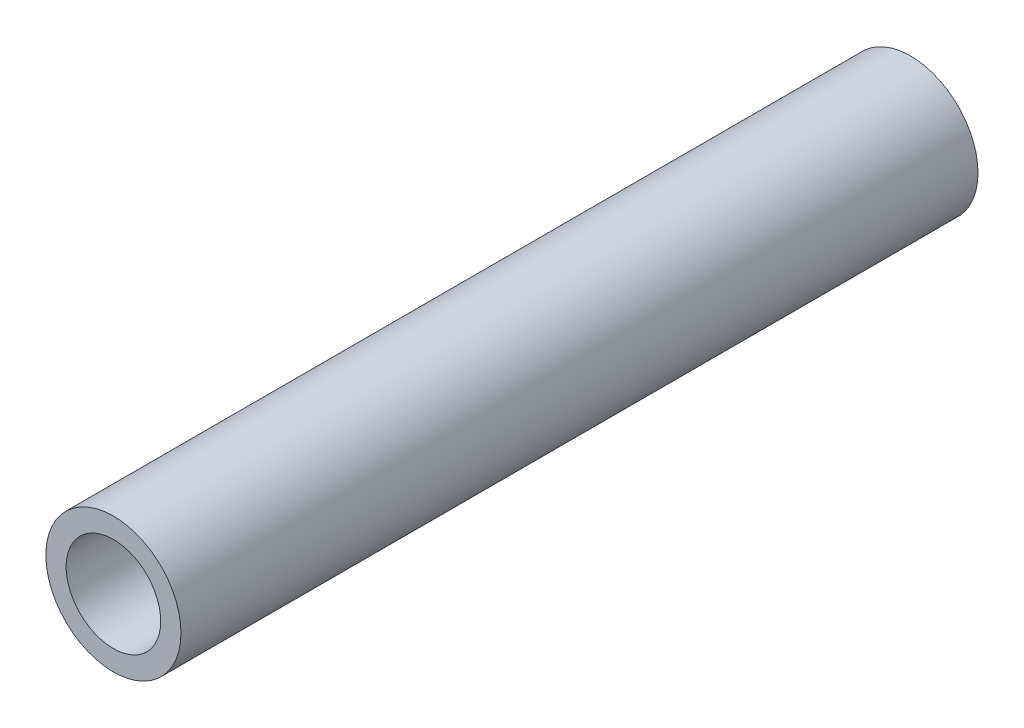
ISO-10303-21;
HEADER;
FILE_DESCRIPTION(('STEP AP214'),'2;1');
FILE_NAME('part.step','',(''),(''),'','','');
FILE_SCHEMA(('AUTOMOTIVE_DESIGN { 1 0 10303 214 1 1 1 1 }'));
ENDSEC;
DATA;
#1=APPLICATION_CONTEXT('core data for automotive mechanical design processes');
#2=APPLICATION_PROTOCOL_DEFINITION('international standard','automotive_design',2000,#1);
#3=PRODUCT_CONTEXT('',#1,'mechanical');
#4=PRODUCT('Part','Part','',(#3));
#5=PRODUCT_RELATED_PRODUCT_CATEGORY('part','',(#4));
#6=PRODUCT_DEFINITION_FORMATION('','',#4);
#7=PRODUCT_DEFINITION_CONTEXT('part definition',#1,'design');
#8=PRODUCT_DEFINITION('design','',#6,#7);
#9=PRODUCT_DEFINITION_SHAPE('','',#8);
#10=(LENGTH_UNIT() NAMED_UNIT(*) SI_UNIT(.MILLI.,.METRE.));
#11=(NAMED_UNIT(*) PLANE_ANGLE_UNIT() SI_UNIT($,.RADIAN.));
#12=(NAMED_UNIT(*) SI_UNIT($,.STERADIAN.) SOLID_ANGLE_UNIT());
#13=UNCERTAINTY_MEASURE_WITH_UNIT(LENGTH_MEASURE(1.E-05),#10,'distance_accuracy_value','');
#14=(GEOMETRIC_REPRESENTATION_CONTEXT(3) GLOBAL_UNCERTAINTY_ASSIGNED_CONTEXT((#13)) GLOBAL_UNIT_ASSIGNED_CONTEXT((#10,
#11,#12)) REPRESENTATION_CONTEXT('',''));
#15=CARTESIAN_POINT('',(0.,0.,0.));
#16=DIRECTION('',(0.,0.,1.));
#17=DIRECTION('',(1.,0.,0.));
#18=AXIS2_PLACEMENT_3D('',#15,#16,#17);
#19=CARTESIAN_POINT('',(0.,0.,10.9));
#20=DIRECTION('',(0.,0.,-1.));
#21=DIRECTION('',(0.,-1.,0.));
#22=AXIS2_PLACEMENT_3D('',#19,#20,#21);
#23=PLANE('',#22);
#24=CARTESIAN_POINT('',(0.,0.,10.9));
#25=DIRECTION('',(0.,0.,-1.));
#26=DIRECTION('',(1.,0.,0.));
#27=AXIS2_PLACEMENT_3D('',#24,#25,#26);
#28=CIRCLE('',#27,1.05);
#29=CARTESIAN_POINT('',(1.05,0.,10.9));
#30=VERTEX_POINT('',#29);
#31=EDGE_CURVE('E22',#30,#30,#28,.T.);
#32=ORIENTED_EDGE('',*,*,#31,.T.);
#33=EDGE_LOOP('',(#32));
#34=FACE_BOUND('',#33,.T.);
#35=CARTESIAN_POINT('',(0.,0.,10.9));
#36=DIRECTION('',(0.,0.,1.));
#37=DIRECTION('',(1.,0.,0.));
#38=AXIS2_PLACEMENT_3D('',#35,#36,#37);
#39=CIRCLE('',#38,1.5);
#40=CARTESIAN_POINT('',(1.5,0.,10.9));
#41=VERTEX_POINT('',#40);
#42=EDGE_CURVE('E10',#41,#41,#39,.T.);
#43=ORIENTED_EDGE('',*,*,#42,.T.);
#44=EDGE_LOOP('',(#43));
#45=FACE_BOUND('',#44,.T.);
#46=ADVANCED_FACE('F15',(#34,#45),#23,.F.);
#47=CARTESIAN_POINT('',(0.,0.,8.9));
#48=DIRECTION('',(0.,0.,1.));
#49=DIRECTION('',(1.,0.,0.));
#50=AXIS2_PLACEMENT_3D('',#47,#48,#49);
#51=CYLINDRICAL_SURFACE('',#50,1.5);
#52=CARTESIAN_POINT('',(0.,0.,-6.8000000000001));
#53=DIRECTION('',(0.,0.,-1.));
#54=DIRECTION('',(1.,0.,0.));
#55=AXIS2_PLACEMENT_3D('',#52,#53,#54);
#56=CIRCLE('',#55,1.5);
#57=CARTESIAN_POINT('',(1.5,0.,-6.8000000000001));
#58=VERTEX_POINT('',#57);
#59=EDGE_CURVE('E44',#58,#58,#56,.T.);
#60=ORIENTED_EDGE('',*,*,#59,.F.);
#61=EDGE_LOOP('',(#60));
#62=FACE_BOUND('',#61,.T.);
#63=ORIENTED_EDGE('',*,*,#42,.F.);
#64=EDGE_LOOP('',(#63));
#65=FACE_BOUND('',#64,.T.);
#66=ADVANCED_FACE('F70',(#62,#65),#51,.T.);
#67=CARTESIAN_POINT('',(0.,0.,8.9));
#68=DIRECTION('',(0.,0.,1.));
#69=DIRECTION('',(1.,0.,0.));
#70=AXIS2_PLACEMENT_3D('',#67,#68,#69);
#71=CYLINDRICAL_SURFACE('',#70,1.05);
#72=CARTESIAN_POINT('',(0.,0.,8.9));
#73=DIRECTION('',(0.,0.,-1.));
#74=DIRECTION('',(1.,0.,0.));
#75=AXIS2_PLACEMENT_3D('',#72,#73,#74);
#76=CIRCLE('',#75,1.05);
#77=CARTESIAN_POINT('',(1.05,0.,8.9));
#78=VERTEX_POINT('',#77);
#79=EDGE_CURVE('E38',#78,#78,#76,.T.);
#80=ORIENTED_EDGE('',*,*,#79,.T.);
#81=EDGE_LOOP('',(#80));
#82=FACE_BOUND('',#81,.T.);
#83=ORIENTED_EDGE('',*,*,#31,.F.);
#84=EDGE_LOOP('',(#83));
#85=FACE_BOUND('',#84,.T.);
#86=ADVANCED_FACE('F60',(#82,#85),#71,.F.);
#87=CARTESIAN_POINT('',(0.,0.,8.9));
#88=DIRECTION('',(0.,0.,-1.));
#89=DIRECTION('',(-1.,0.,0.));
#90=AXIS2_PLACEMENT_3D('',#87,#88,#89);
#91=CYLINDRICAL_SURFACE('',#90,1.);
#92=CARTESIAN_POINT('',(0.,0.,8.9));
#93=DIRECTION('',(0.,0.,1.));
#94=DIRECTION('',(-1.,0.,0.));
#95=AXIS2_PLACEMENT_3D('',#92,#93,#94);
#96=CIRCLE('',#95,1.);
#97=CARTESIAN_POINT('',(-1.,0.,8.9));
#98=VERTEX_POINT('',#97);
#99=EDGE_CURVE('E31',#98,#98,#96,.T.);
#100=ORIENTED_EDGE('',*,*,#99,.T.);
#101=EDGE_LOOP('',(#100));
#102=FACE_BOUND('',#101,.T.);
#103=CARTESIAN_POINT('',(0.,0.,5.19999999999991));
#104=DIRECTION('',(0.,0.,1.));
#105=DIRECTION('',(-1.,0.,0.));
#106=AXIS2_PLACEMENT_3D('',#103,#104,#105);
#107=CIRCLE('',#106,1.);
#108=CARTESIAN_POINT('',(-1.,0.,5.19999999999991));
#109=VERTEX_POINT('',#108);
#110=EDGE_CURVE('E48',#109,#109,#107,.T.);
#111=ORIENTED_EDGE('',*,*,#110,.F.);
#112=EDGE_LOOP('',(#111));
#113=FACE_BOUND('',#112,.T.);
#114=ADVANCED_FACE('F57',(#102,#113),#91,.F.);
#115=CARTESIAN_POINT('',(0.,0.,8.9));
#116=DIRECTION('',(0.,0.,-1.));
#117=DIRECTION('',(0.,-1.,0.));
#118=AXIS2_PLACEMENT_3D('',#115,#116,#117);
#119=PLANE('',#118);
#120=ORIENTED_EDGE('',*,*,#99,.F.);
#121=EDGE_LOOP('',(#120));
#122=FACE_BOUND('',#121,.T.);
#123=ORIENTED_EDGE('',*,*,#79,.F.);
#124=EDGE_LOOP('',(#123));
#125=FACE_BOUND('',#124,.T.);
#126=ADVANCED_FACE('F59',(#122,#125),#119,.F.);
#127=CARTESIAN_POINT('',(0.,0.,-6.8000000000001));
#128=DIRECTION('',(0.,0.,-1.));
#129=DIRECTION('',(0.,-1.,0.));
#130=AXIS2_PLACEMENT_3D('',#127,#128,#129);
#131=PLANE('',#130);
#132=ORIENTED_EDGE('',*,*,#59,.T.);
#133=EDGE_LOOP('',(#132));
#134=FACE_BOUND('',#133,.T.);
#135=ADVANCED_FACE('F67',(#134),#131,.T.);
#136=CARTESIAN_POINT('',(0.,0.,5.19999999999991));
#137=DIRECTION('',(0.,0.,-1.));
#138=DIRECTION('',(0.,-1.,0.));
#139=AXIS2_PLACEMENT_3D('',#136,#137,#138);
#140=PLANE('',#139);
#141=ORIENTED_EDGE('',*,*,#110,.T.);
#142=EDGE_LOOP('',(#141));
#143=FACE_BOUND('',#142,.T.);
#144=ADVANCED_FACE('F55',(#143),#140,.F.);
#145=CLOSED_SHELL('',(#46,#66,#86,#114,#126,#135,#144));
#146=MANIFOLD_SOLID_BREP('B1',#145);
#147=ADVANCED_BREP_SHAPE_REPRESENTATION('',(#18,#146),#14);
#148=SHAPE_DEFINITION_REPRESENTATION(#9,#147);
ENDSEC;
END-ISO-10303-21;
